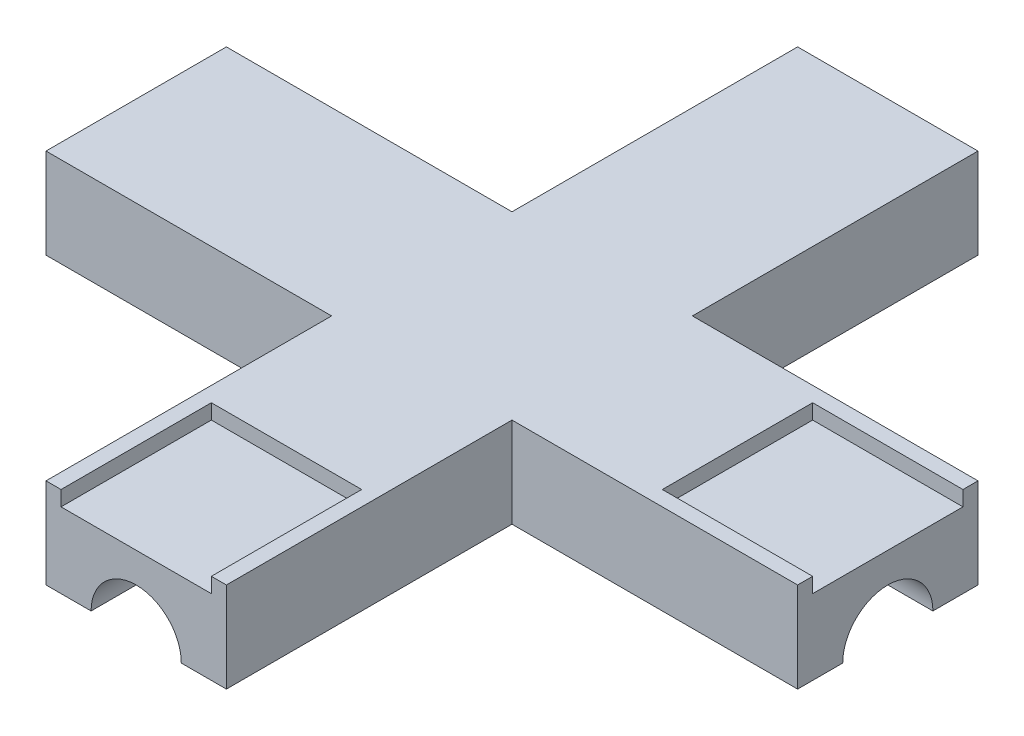
ISO-10303-21;
HEADER;
FILE_DESCRIPTION(('STEP AP214'),'2;1');
FILE_NAME('part.step','',(''),(''),'','','');
FILE_SCHEMA(('AUTOMOTIVE_DESIGN { 1 0 10303 214 1 1 1 1 }'));
ENDSEC;
DATA;
#1=APPLICATION_CONTEXT('core data for automotive mechanical design processes');
#2=APPLICATION_PROTOCOL_DEFINITION('international standard','automotive_design',2000,#1);
#3=PRODUCT_CONTEXT('',#1,'mechanical');
#4=PRODUCT('Part','Part','',(#3));
#5=PRODUCT_RELATED_PRODUCT_CATEGORY('part','',(#4));
#6=PRODUCT_DEFINITION_FORMATION('','',#4);
#7=PRODUCT_DEFINITION_CONTEXT('part definition',#1,'design');
#8=PRODUCT_DEFINITION('design','',#6,#7);
#9=PRODUCT_DEFINITION_SHAPE('','',#8);
#10=(LENGTH_UNIT() NAMED_UNIT(*) SI_UNIT(.MILLI.,.METRE.));
#11=(NAMED_UNIT(*) PLANE_ANGLE_UNIT() SI_UNIT($,.RADIAN.));
#12=(NAMED_UNIT(*) SI_UNIT($,.STERADIAN.) SOLID_ANGLE_UNIT());
#13=UNCERTAINTY_MEASURE_WITH_UNIT(LENGTH_MEASURE(1.E-05),#10,'distance_accuracy_value','');
#14=(GEOMETRIC_REPRESENTATION_CONTEXT(3) GLOBAL_UNCERTAINTY_ASSIGNED_CONTEXT((#13)) GLOBAL_UNIT_ASSIGNED_CONTEXT((#10,
#11,#12)) REPRESENTATION_CONTEXT('',''));
#15=CARTESIAN_POINT('',(0.,0.,0.));
#16=DIRECTION('',(0.,0.,1.));
#17=DIRECTION('',(1.,0.,0.));
#18=AXIS2_PLACEMENT_3D('',#15,#16,#17);
#19=CARTESIAN_POINT('',(-25.001,4.,0.));
#20=DIRECTION('',(1.,0.,0.));
#21=DIRECTION('',(0.,0.,-1.));
#22=AXIS2_PLACEMENT_3D('',#19,#20,#21);
#23=CYLINDRICAL_SURFACE('',#22,3.);
#24=DIRECTION('',(1.,0.,0.));
#25=VECTOR('',#24,1.);
#26=CARTESIAN_POINT('',(-25.001,4.,-3.));
#27=LINE('',#26,#25);
#28=CARTESIAN_POINT('',(-2.99999999999997,4.,-3.));
#29=VERTEX_POINT('',#28);
#30=CARTESIAN_POINT('',(-25.,4.,-3.));
#31=VERTEX_POINT('',#30);
#32=EDGE_CURVE('E403',#29,#31,#27,.F.);
#33=ORIENTED_EDGE('',*,*,#32,.F.);
#34=CARTESIAN_POINT('',(0.,4.,0.));
#35=DIRECTION('',(0.707106781186551,0.,-0.707106781186544));
#36=DIRECTION('',(-0.707106781186544,0.,-0.707106781186551));
#37=AXIS2_PLACEMENT_3D('',#34,#35,#36);
#38=ELLIPSE('',#37,4.24264068711926,3.);
#39=CARTESIAN_POINT('',(0.,7.,0.));
#40=VERTEX_POINT('',#39);
#41=EDGE_CURVE('E315',#40,#29,#38,.F.);
#42=ORIENTED_EDGE('',*,*,#41,.F.);
#43=CARTESIAN_POINT('',(0.,4.,0.));
#44=DIRECTION('',(0.707106781186546,0.,0.707106781186549));
#45=DIRECTION('',(-0.707106781186549,0.,0.707106781186546));
#46=AXIS2_PLACEMENT_3D('',#43,#44,#45);
#47=ELLIPSE('',#46,4.24264068711929,3.);
#48=CARTESIAN_POINT('',(-3.00000000000001,4.,3.));
#49=VERTEX_POINT('',#48);
#50=EDGE_CURVE('E323',#49,#40,#47,.F.);
#51=ORIENTED_EDGE('',*,*,#50,.F.);
#52=DIRECTION('',(1.,0.,0.));
#53=VECTOR('',#52,1.);
#54=CARTESIAN_POINT('',(-25.001,4.,3.));
#55=LINE('',#54,#53);
#56=CARTESIAN_POINT('',(-25.,4.,3.));
#57=VERTEX_POINT('',#56);
#58=EDGE_CURVE('E412',#57,#49,#55,.T.);
#59=ORIENTED_EDGE('',*,*,#58,.F.);
#60=CARTESIAN_POINT('',(-25.,4.,0.));
#61=DIRECTION('',(1.,0.,0.));
#62=DIRECTION('',(0.,0.,-1.));
#63=AXIS2_PLACEMENT_3D('',#60,#61,#62);
#64=CIRCLE('',#63,3.);
#65=EDGE_CURVE('E332',#57,#31,#64,.F.);
#66=ORIENTED_EDGE('',*,*,#65,.T.);
#67=EDGE_LOOP('',(#33,#42,#51,#59,#66));
#68=FACE_BOUND('',#67,.T.);
#69=ADVANCED_FACE('F33',(#68),#23,.F.);
#70=CARTESIAN_POINT('',(-25.,10.,25.));
#71=DIRECTION('',(1.,0.,0.));
#72=DIRECTION('',(0.,0.,-1.));
#73=AXIS2_PLACEMENT_3D('',#70,#71,#72);
#74=PLANE('',#73);
#75=DIRECTION('',(0.,0.,-1.));
#76=VECTOR('',#75,1.);
#77=CARTESIAN_POINT('',(-25.,4.,25.));
#78=LINE('',#77,#76);
#79=CARTESIAN_POINT('',(-25.,4.,6.00000000000001));
#80=VERTEX_POINT('',#79);
#81=EDGE_CURVE('E414',#80,#57,#78,.T.);
#82=ORIENTED_EDGE('',*,*,#81,.F.);
#83=DIRECTION('',(0.,1.,0.));
#84=VECTOR('',#83,1.);
#85=CARTESIAN_POINT('',(-25.,-0.000999999999999265,6.00000000000001));
#86=LINE('',#85,#84);
#87=CARTESIAN_POINT('',(-25.,10.,6.00000000000001));
#88=VERTEX_POINT('',#87);
#89=EDGE_CURVE('E382',#80,#88,#86,.T.);
#90=ORIENTED_EDGE('',*,*,#89,.T.);
#91=DIRECTION('',(0.,0.,1.));
#92=VECTOR('',#91,1.);
#93=CARTESIAN_POINT('',(-25.,10.,25.));
#94=LINE('',#93,#92);
#95=CARTESIAN_POINT('',(-25.,10.,-6.));
#96=VERTEX_POINT('',#95);
#97=EDGE_CURVE('E335',#96,#88,#94,.T.);
#98=ORIENTED_EDGE('',*,*,#97,.F.);
#99=DIRECTION('',(0.,1.,0.));
#100=VECTOR('',#99,1.);
#101=CARTESIAN_POINT('',(-25.,-0.000999999999999265,-6.));
#102=LINE('',#101,#100);
#103=CARTESIAN_POINT('',(-25.,4.,-6.));
#104=VERTEX_POINT('',#103);
#105=EDGE_CURVE('E368',#104,#96,#102,.T.);
#106=ORIENTED_EDGE('',*,*,#105,.F.);
#107=EDGE_CURVE('E56',#31,#104,#78,.T.);
#108=ORIENTED_EDGE('',*,*,#107,.F.);
#109=ORIENTED_EDGE('',*,*,#65,.F.);
#110=EDGE_LOOP('',(#82,#90,#98,#106,#108,#109));
#111=FACE_BOUND('',#110,.T.);
#112=ADVANCED_FACE('F35',(#111),#74,.F.);
#113=CARTESIAN_POINT('',(25.,10.,25.));
#114=DIRECTION('',(0.,0.,-1.));
#115=DIRECTION('',(-1.,0.,0.));
#116=AXIS2_PLACEMENT_3D('',#113,#114,#115);
#117=PLANE('',#116);
#118=DIRECTION('',(-1.,0.,0.));
#119=VECTOR('',#118,1.);
#120=CARTESIAN_POINT('',(25.,4.,25.));
#121=LINE('',#120,#119);
#122=CARTESIAN_POINT('',(6.,4.,25.));
#123=VERTEX_POINT('',#122);
#124=CARTESIAN_POINT('',(2.99999999999991,4.,25.));
#125=VERTEX_POINT('',#124);
#126=EDGE_CURVE('E209',#123,#125,#121,.T.);
#127=ORIENTED_EDGE('',*,*,#126,.F.);
#128=DIRECTION('',(0.,1.,0.));
#129=VECTOR('',#128,1.);
#130=CARTESIAN_POINT('',(6.,-0.000999999999999265,25.));
#131=LINE('',#130,#129);
#132=CARTESIAN_POINT('',(6.,10.,25.));
#133=VERTEX_POINT('',#132);
#134=EDGE_CURVE('E220',#123,#133,#131,.T.);
#135=ORIENTED_EDGE('',*,*,#134,.T.);
#136=DIRECTION('',(1.,0.,0.));
#137=VECTOR('',#136,1.);
#138=CARTESIAN_POINT('',(25.,10.,25.));
#139=LINE('',#138,#137);
#140=CARTESIAN_POINT('',(5.,10.,25.));
#141=VERTEX_POINT('',#140);
#142=EDGE_CURVE('E338',#141,#133,#139,.T.);
#143=ORIENTED_EDGE('',*,*,#142,.F.);
#144=DIRECTION('',(0.,1.,0.));
#145=VECTOR('',#144,1.);
#146=CARTESIAN_POINT('',(5.,9.,25.));
#147=LINE('',#146,#145);
#148=CARTESIAN_POINT('',(5.,9.,25.));
#149=VERTEX_POINT('',#148);
#150=EDGE_CURVE('E273',#149,#141,#147,.T.);
#151=ORIENTED_EDGE('',*,*,#150,.F.);
#152=DIRECTION('',(1.,0.,0.));
#153=VECTOR('',#152,1.);
#154=CARTESIAN_POINT('',(5.,9.,25.));
#155=LINE('',#154,#153);
#156=CARTESIAN_POINT('',(-5.,9.,25.));
#157=VERTEX_POINT('',#156);
#158=EDGE_CURVE('E297',#157,#149,#155,.T.);
#159=ORIENTED_EDGE('',*,*,#158,.F.);
#160=DIRECTION('',(0.,1.,0.));
#161=VECTOR('',#160,1.);
#162=CARTESIAN_POINT('',(-5.,9.,25.));
#163=LINE('',#162,#161);
#164=CARTESIAN_POINT('',(-5.,10.,25.));
#165=VERTEX_POINT('',#164);
#166=EDGE_CURVE('E308',#157,#165,#163,.T.);
#167=ORIENTED_EDGE('',*,*,#166,.T.);
#168=CARTESIAN_POINT('',(-6.00000000000001,10.,25.));
#169=VERTEX_POINT('',#168);
#170=EDGE_CURVE('E339',#169,#165,#139,.T.);
#171=ORIENTED_EDGE('',*,*,#170,.F.);
#172=DIRECTION('',(0.,1.,0.));
#173=VECTOR('',#172,1.);
#174=CARTESIAN_POINT('',(-6.00000000000001,-0.000999999999999265,25.));
#175=LINE('',#174,#173);
#176=CARTESIAN_POINT('',(-6.00000000000001,4.,25.));
#177=VERTEX_POINT('',#176);
#178=EDGE_CURVE('E384',#177,#169,#175,.T.);
#179=ORIENTED_EDGE('',*,*,#178,.F.);
#180=CARTESIAN_POINT('',(-3.00000000000009,4.,25.));
#181=VERTEX_POINT('',#180);
#182=EDGE_CURVE('E228',#181,#177,#121,.T.);
#183=ORIENTED_EDGE('',*,*,#182,.F.);
#184=CARTESIAN_POINT('',(0.,4.,25.));
#185=DIRECTION('',(0.,0.,1.));
#186=DIRECTION('',(1.,0.,0.));
#187=AXIS2_PLACEMENT_3D('',#184,#185,#186);
#188=CIRCLE('',#187,3.);
#189=EDGE_CURVE('E224',#125,#181,#188,.T.);
#190=ORIENTED_EDGE('',*,*,#189,.F.);
#191=EDGE_LOOP('',(#127,#135,#143,#151,#159,#167,#171,#179,#183,#190));
#192=FACE_BOUND('',#191,.T.);
#193=ADVANCED_FACE('F218',(#192),#117,.F.);
#194=CARTESIAN_POINT('',(25.,10.,25.));
#195=DIRECTION('',(-1.,0.,0.));
#196=DIRECTION('',(0.,0.,1.));
#197=AXIS2_PLACEMENT_3D('',#194,#195,#196);
#198=PLANE('',#197);
#199=DIRECTION('',(0.,0.,1.));
#200=VECTOR('',#199,1.);
#201=CARTESIAN_POINT('',(25.,4.,25.));
#202=LINE('',#201,#200);
#203=CARTESIAN_POINT('',(25.,4.,-6.00000000000001));
#204=VERTEX_POINT('',#203);
#205=CARTESIAN_POINT('',(25.,4.,-3.));
#206=VERTEX_POINT('',#205);
#207=EDGE_CURVE('E394',#204,#206,#202,.T.);
#208=ORIENTED_EDGE('',*,*,#207,.F.);
#209=DIRECTION('',(0.,1.,0.));
#210=VECTOR('',#209,1.);
#211=CARTESIAN_POINT('',(25.,-0.000999999999999265,-6.00000000000001));
#212=LINE('',#211,#210);
#213=CARTESIAN_POINT('',(25.,10.,-6.00000000000001));
#214=VERTEX_POINT('',#213);
#215=EDGE_CURVE('E249',#204,#214,#212,.T.);
#216=ORIENTED_EDGE('',*,*,#215,.T.);
#217=DIRECTION('',(0.,0.,-1.));
#218=VECTOR('',#217,1.);
#219=CARTESIAN_POINT('',(25.,10.,25.));
#220=LINE('',#219,#218);
#221=CARTESIAN_POINT('',(25.,10.,-5.));
#222=VERTEX_POINT('',#221);
#223=EDGE_CURVE('E341',#222,#214,#220,.T.);
#224=ORIENTED_EDGE('',*,*,#223,.F.);
#225=DIRECTION('',(0.,1.,0.));
#226=VECTOR('',#225,1.);
#227=CARTESIAN_POINT('',(25.,9.,-5.));
#228=LINE('',#227,#226);
#229=CARTESIAN_POINT('',(25.,9.,-5.));
#230=VERTEX_POINT('',#229);
#231=EDGE_CURVE('E268',#230,#222,#228,.T.);
#232=ORIENTED_EDGE('',*,*,#231,.F.);
#233=DIRECTION('',(0.,0.,-1.));
#234=VECTOR('',#233,1.);
#235=CARTESIAN_POINT('',(25.,9.,-5.));
#236=LINE('',#235,#234);
#237=CARTESIAN_POINT('',(25.,9.,5.));
#238=VERTEX_POINT('',#237);
#239=EDGE_CURVE('E255',#238,#230,#236,.T.);
#240=ORIENTED_EDGE('',*,*,#239,.F.);
#241=DIRECTION('',(0.,1.,0.));
#242=VECTOR('',#241,1.);
#243=CARTESIAN_POINT('',(25.,9.,5.));
#244=LINE('',#243,#242);
#245=CARTESIAN_POINT('',(25.,10.,5.));
#246=VERTEX_POINT('',#245);
#247=EDGE_CURVE('E278',#238,#246,#244,.T.);
#248=ORIENTED_EDGE('',*,*,#247,.T.);
#249=CARTESIAN_POINT('',(25.,10.,6.));
#250=VERTEX_POINT('',#249);
#251=EDGE_CURVE('E342',#250,#246,#220,.T.);
#252=ORIENTED_EDGE('',*,*,#251,.F.);
#253=DIRECTION('',(0.,1.,0.));
#254=VECTOR('',#253,1.);
#255=CARTESIAN_POINT('',(25.,-0.000999999999999265,6.));
#256=LINE('',#255,#254);
#257=CARTESIAN_POINT('',(25.,4.,6.));
#258=VERTEX_POINT('',#257);
#259=EDGE_CURVE('E233',#258,#250,#256,.T.);
#260=ORIENTED_EDGE('',*,*,#259,.F.);
#261=CARTESIAN_POINT('',(25.,4.,3.));
#262=VERTEX_POINT('',#261);
#263=EDGE_CURVE('E226',#262,#258,#202,.T.);
#264=ORIENTED_EDGE('',*,*,#263,.F.);
#265=CARTESIAN_POINT('',(25.,4.,0.));
#266=DIRECTION('',(1.,0.,0.));
#267=DIRECTION('',(0.,0.,-1.));
#268=AXIS2_PLACEMENT_3D('',#265,#266,#267);
#269=CIRCLE('',#268,3.);
#270=EDGE_CURVE('E329',#206,#262,#269,.T.);
#271=ORIENTED_EDGE('',*,*,#270,.F.);
#272=EDGE_LOOP('',(#208,#216,#224,#232,#240,#248,#252,#260,#264,#271));
#273=FACE_BOUND('',#272,.T.);
#274=ADVANCED_FACE('F436',(#273),#198,.F.);
#275=CARTESIAN_POINT('',(25.,10.,-25.));
#276=DIRECTION('',(0.,0.,1.));
#277=DIRECTION('',(1.,0.,0.));
#278=AXIS2_PLACEMENT_3D('',#275,#276,#277);
#279=PLANE('',#278);
#280=DIRECTION('',(1.,0.,0.));
#281=VECTOR('',#280,1.);
#282=CARTESIAN_POINT('',(25.,4.,-25.));
#283=LINE('',#282,#281);
#284=CARTESIAN_POINT('',(-6.,4.,-25.));
#285=VERTEX_POINT('',#284);
#286=CARTESIAN_POINT('',(-2.99999999999974,4.,-25.));
#287=VERTEX_POINT('',#286);
#288=EDGE_CURVE('E360',#285,#287,#283,.T.);
#289=ORIENTED_EDGE('',*,*,#288,.F.);
#290=DIRECTION('',(0.,1.,0.));
#291=VECTOR('',#290,1.);
#292=CARTESIAN_POINT('',(-6.,-0.000999999999999265,-25.));
#293=LINE('',#292,#291);
#294=CARTESIAN_POINT('',(-6.,10.,-25.));
#295=VERTEX_POINT('',#294);
#296=EDGE_CURVE('E245',#285,#295,#293,.T.);
#297=ORIENTED_EDGE('',*,*,#296,.T.);
#298=DIRECTION('',(-1.,0.,0.));
#299=VECTOR('',#298,1.);
#300=CARTESIAN_POINT('',(25.,10.,-25.));
#301=LINE('',#300,#299);
#302=CARTESIAN_POINT('',(6.,10.,-25.));
#303=VERTEX_POINT('',#302);
#304=EDGE_CURVE('E41',#303,#295,#301,.T.);
#305=ORIENTED_EDGE('',*,*,#304,.F.);
#306=DIRECTION('',(0.,1.,0.));
#307=VECTOR('',#306,1.);
#308=CARTESIAN_POINT('',(6.,-0.000999999999999265,-25.));
#309=LINE('',#308,#307);
#310=CARTESIAN_POINT('',(6.,4.,-25.));
#311=VERTEX_POINT('',#310);
#312=EDGE_CURVE('E248',#311,#303,#309,.T.);
#313=ORIENTED_EDGE('',*,*,#312,.F.);
#314=CARTESIAN_POINT('',(3.00000000000026,4.,-25.));
#315=VERTEX_POINT('',#314);
#316=EDGE_CURVE('E48',#315,#311,#283,.T.);
#317=ORIENTED_EDGE('',*,*,#316,.F.);
#318=CARTESIAN_POINT('',(2.61861100413235E-13,4.,-25.));
#319=DIRECTION('',(0.,0.,-1.));
#320=DIRECTION('',(-1.,0.,0.));
#321=AXIS2_PLACEMENT_3D('',#318,#319,#320);
#322=CIRCLE('',#321,3.);
#323=EDGE_CURVE('E318',#287,#315,#322,.T.);
#324=ORIENTED_EDGE('',*,*,#323,.F.);
#325=EDGE_LOOP('',(#289,#297,#305,#313,#317,#324));
#326=FACE_BOUND('',#325,.T.);
#327=ADVANCED_FACE('F357',(#326),#279,.F.);
#328=DIRECTION('',(1.,0.,0.));
#329=VECTOR('',#328,1.);
#330=CARTESIAN_POINT('',(-25.001,4.,-3.));
#331=LINE('',#330,#329);
#332=CARTESIAN_POINT('',(3.00000000000003,4.,-3.));
#333=VERTEX_POINT('',#332);
#334=EDGE_CURVE('E389',#206,#333,#331,.F.);
#335=ORIENTED_EDGE('',*,*,#334,.F.);
#336=ORIENTED_EDGE('',*,*,#270,.T.);
#337=DIRECTION('',(1.,0.,0.));
#338=VECTOR('',#337,1.);
#339=CARTESIAN_POINT('',(-25.001,4.,3.));
#340=LINE('',#339,#338);
#341=CARTESIAN_POINT('',(2.99999999999999,4.,3.));
#342=VERTEX_POINT('',#341);
#343=EDGE_CURVE('E420',#342,#262,#340,.T.);
#344=ORIENTED_EDGE('',*,*,#343,.F.);
#345=CARTESIAN_POINT('',(0.,4.,0.));
#346=DIRECTION('',(-0.707106781186549,0.,0.707106781186546));
#347=DIRECTION('',(0.707106781186546,0.,0.707106781186549));
#348=AXIS2_PLACEMENT_3D('',#345,#346,#347);
#349=ELLIPSE('',#348,4.24264068711928,3.);
#350=EDGE_CURVE('E322',#40,#342,#349,.F.);
#351=ORIENTED_EDGE('',*,*,#350,.F.);
#352=CARTESIAN_POINT('',(0.,4.,0.));
#353=DIRECTION('',(-0.707106781186544,0.,-0.707106781186551));
#354=DIRECTION('',(0.707106781186551,0.,-0.707106781186544));
#355=AXIS2_PLACEMENT_3D('',#352,#353,#354);
#356=ELLIPSE('',#355,4.24264068711931,3.);
#357=EDGE_CURVE('E281',#333,#40,#356,.F.);
#358=ORIENTED_EDGE('',*,*,#357,.F.);
#359=EDGE_LOOP('',(#335,#336,#344,#351,#358));
#360=FACE_BOUND('',#359,.T.);
#361=ADVANCED_FACE('F433',(#360),#23,.F.);
#362=CARTESIAN_POINT('',(-2.61871574857254E-13,4.,25.0010000000003));
#363=DIRECTION('',(0.,0.,-1.));
#364=DIRECTION('',(-1.,0.,0.));
#365=AXIS2_PLACEMENT_3D('',#362,#363,#364);
#366=CYLINDRICAL_SURFACE('',#365,3.);
#367=DIRECTION('',(0.,0.,-1.));
#368=VECTOR('',#367,1.);
#369=CARTESIAN_POINT('',(-3.00000000000026,4.,25.0010000000002));
#370=LINE('',#369,#368);
#371=EDGE_CURVE('E401',#287,#29,#370,.F.);
#372=ORIENTED_EDGE('',*,*,#371,.F.);
#373=ORIENTED_EDGE('',*,*,#323,.T.);
#374=DIRECTION('',(0.,0.,-1.));
#375=VECTOR('',#374,1.);
#376=CARTESIAN_POINT('',(2.99999999999974,4.,25.0010000000003));
#377=LINE('',#376,#375);
#378=EDGE_CURVE('E391',#333,#315,#377,.T.);
#379=ORIENTED_EDGE('',*,*,#378,.F.);
#380=ORIENTED_EDGE('',*,*,#357,.T.);
#381=ORIENTED_EDGE('',*,*,#41,.T.);
#382=EDGE_LOOP('',(#372,#373,#379,#380,#381));
#383=FACE_BOUND('',#382,.T.);
#384=ADVANCED_FACE('F483',(#383),#366,.F.);
#385=CARTESIAN_POINT('',(0.,4.,-25.0010000000001));
#386=DIRECTION('',(0.,0.,1.));
#387=DIRECTION('',(1.,0.,0.));
#388=AXIS2_PLACEMENT_3D('',#385,#386,#387);
#389=CYLINDRICAL_SURFACE('',#388,3.);
#390=DIRECTION('',(0.,0.,1.));
#391=VECTOR('',#390,1.);
#392=CARTESIAN_POINT('',(3.00000000000009,4.,-25.0010000000001));
#393=LINE('',#392,#391);
#394=EDGE_CURVE('E225',#125,#342,#393,.F.);
#395=ORIENTED_EDGE('',*,*,#394,.F.);
#396=ORIENTED_EDGE('',*,*,#189,.T.);
#397=DIRECTION('',(0.,0.,1.));
#398=VECTOR('',#397,1.);
#399=CARTESIAN_POINT('',(-2.99999999999991,4.,-25.0010000000001));
#400=LINE('',#399,#398);
#401=EDGE_CURVE('E410',#49,#181,#400,.T.);
#402=ORIENTED_EDGE('',*,*,#401,.F.);
#403=ORIENTED_EDGE('',*,*,#50,.T.);
#404=ORIENTED_EDGE('',*,*,#350,.T.);
#405=EDGE_LOOP('',(#395,#396,#402,#403,#404));
#406=FACE_BOUND('',#405,.T.);
#407=ADVANCED_FACE('F480',(#406),#389,.F.);
#408=CARTESIAN_POINT('',(25.,-0.000999999999999265,-6.00000000000001));
#409=DIRECTION('',(0.,0.,1.));
#410=DIRECTION('',(1.,0.,0.));
#411=AXIS2_PLACEMENT_3D('',#408,#409,#410);
#412=PLANE('',#411);
#413=DIRECTION('',(1.,0.,0.));
#414=VECTOR('',#413,1.);
#415=CARTESIAN_POINT('',(25.,4.,-6.00000000000001));
#416=LINE('',#415,#414);
#417=CARTESIAN_POINT('',(6.00000000000001,4.,-6.00000000000001));
#418=VERTEX_POINT('',#417);
#419=EDGE_CURVE('E397',#418,#204,#416,.T.);
#420=ORIENTED_EDGE('',*,*,#419,.F.);
#421=DIRECTION('',(0.,1.,0.));
#422=VECTOR('',#421,1.);
#423=CARTESIAN_POINT('',(6.00000000000001,-0.000999999999999265,-6.00000000000001));
#424=LINE('',#423,#422);
#425=CARTESIAN_POINT('',(6.00000000000001,10.,-6.00000000000001));
#426=VERTEX_POINT('',#425);
#427=EDGE_CURVE('E252',#418,#426,#424,.T.);
#428=ORIENTED_EDGE('',*,*,#427,.T.);
#429=DIRECTION('',(1.,0.,0.));
#430=VECTOR('',#429,1.);
#431=CARTESIAN_POINT('',(25.,10.,-6.00000000000001));
#432=LINE('',#431,#430);
#433=EDGE_CURVE('E244',#426,#214,#432,.T.);
#434=ORIENTED_EDGE('',*,*,#433,.T.);
#435=ORIENTED_EDGE('',*,*,#215,.F.);
#436=EDGE_LOOP('',(#420,#428,#434,#435));
#437=FACE_BOUND('',#436,.T.);
#438=ADVANCED_FACE('F482',(#437),#412,.F.);
#439=CARTESIAN_POINT('',(6.,-0.000999999999999265,-25.));
#440=DIRECTION('',(-1.,0.,0.));
#441=DIRECTION('',(0.,0.,1.));
#442=AXIS2_PLACEMENT_3D('',#439,#440,#441);
#443=PLANE('',#442);
#444=DIRECTION('',(0.,0.,1.));
#445=VECTOR('',#444,1.);
#446=CARTESIAN_POINT('',(6.,4.,-25.));
#447=LINE('',#446,#445);
#448=EDGE_CURVE('E399',#311,#418,#447,.T.);
#449=ORIENTED_EDGE('',*,*,#448,.F.);
#450=ORIENTED_EDGE('',*,*,#312,.T.);
#451=DIRECTION('',(0.,0.,1.));
#452=VECTOR('',#451,1.);
#453=CARTESIAN_POINT('',(6.,10.,-25.));
#454=LINE('',#453,#452);
#455=EDGE_CURVE('E241',#303,#426,#454,.T.);
#456=ORIENTED_EDGE('',*,*,#455,.T.);
#457=ORIENTED_EDGE('',*,*,#427,.F.);
#458=EDGE_LOOP('',(#449,#450,#456,#457));
#459=FACE_BOUND('',#458,.T.);
#460=ADVANCED_FACE('F489',(#459),#443,.F.);
#461=CARTESIAN_POINT('',(-6.,-0.000999999999999265,-25.));
#462=DIRECTION('',(1.,0.,0.));
#463=DIRECTION('',(0.,0.,-1.));
#464=AXIS2_PLACEMENT_3D('',#461,#462,#463);
#465=PLANE('',#464);
#466=DIRECTION('',(0.,0.,-1.));
#467=VECTOR('',#466,1.);
#468=CARTESIAN_POINT('',(-6.,4.,-25.));
#469=LINE('',#468,#467);
#470=CARTESIAN_POINT('',(-6.,4.,-6.));
#471=VERTEX_POINT('',#470);
#472=EDGE_CURVE('E406',#471,#285,#469,.T.);
#473=ORIENTED_EDGE('',*,*,#472,.F.);
#474=DIRECTION('',(0.,1.,0.));
#475=VECTOR('',#474,1.);
#476=CARTESIAN_POINT('',(-6.,-0.000999999999999265,-6.));
#477=LINE('',#476,#475);
#478=CARTESIAN_POINT('',(-6.,10.,-6.));
#479=VERTEX_POINT('',#478);
#480=EDGE_CURVE('E363',#471,#479,#477,.T.);
#481=ORIENTED_EDGE('',*,*,#480,.T.);
#482=DIRECTION('',(0.,0.,-1.));
#483=VECTOR('',#482,1.);
#484=CARTESIAN_POINT('',(-6.,10.,-25.));
#485=LINE('',#484,#483);
#486=EDGE_CURVE('E352',#479,#295,#485,.T.);
#487=ORIENTED_EDGE('',*,*,#486,.T.);
#488=ORIENTED_EDGE('',*,*,#296,.F.);
#489=EDGE_LOOP('',(#473,#481,#487,#488));
#490=FACE_BOUND('',#489,.T.);
#491=ADVANCED_FACE('F365',(#490),#465,.F.);
#492=CARTESIAN_POINT('',(-6.,-0.000999999999999265,-6.));
#493=DIRECTION('',(0.,0.,1.));
#494=DIRECTION('',(1.,0.,0.));
#495=AXIS2_PLACEMENT_3D('',#492,#493,#494);
#496=PLANE('',#495);
#497=DIRECTION('',(1.,0.,0.));
#498=VECTOR('',#497,1.);
#499=CARTESIAN_POINT('',(-6.,4.,-6.));
#500=LINE('',#499,#498);
#501=EDGE_CURVE('E408',#104,#471,#500,.T.);
#502=ORIENTED_EDGE('',*,*,#501,.F.);
#503=ORIENTED_EDGE('',*,*,#105,.T.);
#504=DIRECTION('',(1.,0.,0.));
#505=VECTOR('',#504,1.);
#506=CARTESIAN_POINT('',(-6.,10.,-6.));
#507=LINE('',#506,#505);
#508=EDGE_CURVE('E369',#96,#479,#507,.T.);
#509=ORIENTED_EDGE('',*,*,#508,.T.);
#510=ORIENTED_EDGE('',*,*,#480,.F.);
#511=EDGE_LOOP('',(#502,#503,#509,#510));
#512=FACE_BOUND('',#511,.T.);
#513=ADVANCED_FACE('F560',(#512),#496,.F.);
#514=CARTESIAN_POINT('',(-6.00000000000001,-0.000999999999999265,6.));
#515=DIRECTION('',(0.,0.,-1.));
#516=DIRECTION('',(-1.,0.,0.));
#517=AXIS2_PLACEMENT_3D('',#514,#515,#516);
#518=PLANE('',#517);
#519=DIRECTION('',(-1.,0.,0.));
#520=VECTOR('',#519,1.);
#521=CARTESIAN_POINT('',(-6.00000000000001,4.,6.));
#522=LINE('',#521,#520);
#523=CARTESIAN_POINT('',(-6.00000000000001,4.,6.));
#524=VERTEX_POINT('',#523);
#525=EDGE_CURVE('E416',#524,#80,#522,.T.);
#526=ORIENTED_EDGE('',*,*,#525,.F.);
#527=DIRECTION('',(0.,1.,0.));
#528=VECTOR('',#527,1.);
#529=CARTESIAN_POINT('',(-6.00000000000001,-0.000999999999999265,6.));
#530=LINE('',#529,#528);
#531=CARTESIAN_POINT('',(-6.00000000000001,10.,6.));
#532=VERTEX_POINT('',#531);
#533=EDGE_CURVE('E372',#524,#532,#530,.T.);
#534=ORIENTED_EDGE('',*,*,#533,.T.);
#535=DIRECTION('',(-1.,0.,0.));
#536=VECTOR('',#535,1.);
#537=CARTESIAN_POINT('',(-6.00000000000001,10.,6.));
#538=LINE('',#537,#536);
#539=EDGE_CURVE('E236',#532,#88,#538,.T.);
#540=ORIENTED_EDGE('',*,*,#539,.T.);
#541=ORIENTED_EDGE('',*,*,#89,.F.);
#542=EDGE_LOOP('',(#526,#534,#540,#541));
#543=FACE_BOUND('',#542,.T.);
#544=ADVANCED_FACE('F468',(#543),#518,.F.);
#545=CARTESIAN_POINT('',(-6.00000000000001,-0.000999999999999265,6.));
#546=DIRECTION('',(1.,0.,0.));
#547=DIRECTION('',(0.,0.,-1.));
#548=AXIS2_PLACEMENT_3D('',#545,#546,#547);
#549=PLANE('',#548);
#550=DIRECTION('',(0.,0.,-1.));
#551=VECTOR('',#550,1.);
#552=CARTESIAN_POINT('',(-6.00000000000001,4.,6.));
#553=LINE('',#552,#551);
#554=EDGE_CURVE('E418',#177,#524,#553,.T.);
#555=ORIENTED_EDGE('',*,*,#554,.F.);
#556=ORIENTED_EDGE('',*,*,#178,.T.);
#557=DIRECTION('',(0.,0.,-1.));
#558=VECTOR('',#557,1.);
#559=CARTESIAN_POINT('',(-6.00000000000001,10.,6.));
#560=LINE('',#559,#558);
#561=EDGE_CURVE('E379',#169,#532,#560,.T.);
#562=ORIENTED_EDGE('',*,*,#561,.T.);
#563=ORIENTED_EDGE('',*,*,#533,.F.);
#564=EDGE_LOOP('',(#555,#556,#562,#563));
#565=FACE_BOUND('',#564,.T.);
#566=ADVANCED_FACE('F461',(#565),#549,.F.);
#567=CARTESIAN_POINT('',(25.,-0.000999999999999265,6.));
#568=DIRECTION('',(0.,0.,-1.));
#569=DIRECTION('',(-1.,0.,0.));
#570=AXIS2_PLACEMENT_3D('',#567,#568,#569);
#571=PLANE('',#570);
#572=DIRECTION('',(-1.,0.,0.));
#573=VECTOR('',#572,1.);
#574=CARTESIAN_POINT('',(25.,4.,6.));
#575=LINE('',#574,#573);
#576=CARTESIAN_POINT('',(6.,4.,6.));
#577=VERTEX_POINT('',#576);
#578=EDGE_CURVE('E212',#258,#577,#575,.T.);
#579=ORIENTED_EDGE('',*,*,#578,.F.);
#580=ORIENTED_EDGE('',*,*,#259,.T.);
#581=DIRECTION('',(-1.,0.,0.));
#582=VECTOR('',#581,1.);
#583=CARTESIAN_POINT('',(25.,10.,6.));
#584=LINE('',#583,#582);
#585=CARTESIAN_POINT('',(6.,10.,6.));
#586=VERTEX_POINT('',#585);
#587=EDGE_CURVE('E387',#250,#586,#584,.T.);
#588=ORIENTED_EDGE('',*,*,#587,.T.);
#589=DIRECTION('',(0.,1.,0.));
#590=VECTOR('',#589,1.);
#591=CARTESIAN_POINT('',(6.,-0.000999999999999265,6.));
#592=LINE('',#591,#590);
#593=EDGE_CURVE('E234',#577,#586,#592,.T.);
#594=ORIENTED_EDGE('',*,*,#593,.F.);
#595=EDGE_LOOP('',(#579,#580,#588,#594));
#596=FACE_BOUND('',#595,.T.);
#597=ADVANCED_FACE('F439',(#596),#571,.F.);
#598=CARTESIAN_POINT('',(6.,-0.000999999999999265,6.));
#599=DIRECTION('',(-1.,0.,0.));
#600=DIRECTION('',(0.,0.,1.));
#601=AXIS2_PLACEMENT_3D('',#598,#599,#600);
#602=PLANE('',#601);
#603=DIRECTION('',(0.,0.,1.));
#604=VECTOR('',#603,1.);
#605=CARTESIAN_POINT('',(6.,4.,6.));
#606=LINE('',#605,#604);
#607=EDGE_CURVE('E11',#577,#123,#606,.T.);
#608=ORIENTED_EDGE('',*,*,#607,.F.);
#609=ORIENTED_EDGE('',*,*,#593,.T.);
#610=DIRECTION('',(0.,0.,1.));
#611=VECTOR('',#610,1.);
#612=CARTESIAN_POINT('',(6.,10.,6.));
#613=LINE('',#612,#611);
#614=EDGE_CURVE('E231',#586,#133,#613,.T.);
#615=ORIENTED_EDGE('',*,*,#614,.T.);
#616=ORIENTED_EDGE('',*,*,#134,.F.);
#617=EDGE_LOOP('',(#608,#609,#615,#616));
#618=FACE_BOUND('',#617,.T.);
#619=ADVANCED_FACE('F229',(#618),#602,.F.);
#620=CARTESIAN_POINT('',(0.,10.,0.));
#621=DIRECTION('',(0.,1.,0.));
#622=DIRECTION('',(0.,0.,1.));
#623=AXIS2_PLACEMENT_3D('',#620,#621,#622);
#624=PLANE('',#623);
#625=ORIENTED_EDGE('',*,*,#587,.F.);
#626=ORIENTED_EDGE('',*,*,#251,.T.);
#627=DIRECTION('',(1.,0.,0.));
#628=VECTOR('',#627,1.);
#629=CARTESIAN_POINT('',(25.,10.,5.));
#630=LINE('',#629,#628);
#631=CARTESIAN_POINT('',(15.,10.,5.));
#632=VERTEX_POINT('',#631);
#633=EDGE_CURVE('E259',#632,#246,#630,.T.);
#634=ORIENTED_EDGE('',*,*,#633,.F.);
#635=DIRECTION('',(0.,0.,1.));
#636=VECTOR('',#635,1.);
#637=CARTESIAN_POINT('',(15.,10.,-5.));
#638=LINE('',#637,#636);
#639=CARTESIAN_POINT('',(15.,10.,-5.));
#640=VERTEX_POINT('',#639);
#641=EDGE_CURVE('E272',#640,#632,#638,.T.);
#642=ORIENTED_EDGE('',*,*,#641,.F.);
#643=DIRECTION('',(-1.,0.,0.));
#644=VECTOR('',#643,1.);
#645=CARTESIAN_POINT('',(25.,10.,-5.));
#646=LINE('',#645,#644);
#647=EDGE_CURVE('E269',#222,#640,#646,.T.);
#648=ORIENTED_EDGE('',*,*,#647,.F.);
#649=ORIENTED_EDGE('',*,*,#223,.T.);
#650=ORIENTED_EDGE('',*,*,#433,.F.);
#651=ORIENTED_EDGE('',*,*,#455,.F.);
#652=ORIENTED_EDGE('',*,*,#304,.T.);
#653=ORIENTED_EDGE('',*,*,#486,.F.);
#654=ORIENTED_EDGE('',*,*,#508,.F.);
#655=ORIENTED_EDGE('',*,*,#97,.T.);
#656=ORIENTED_EDGE('',*,*,#539,.F.);
#657=ORIENTED_EDGE('',*,*,#561,.F.);
#658=ORIENTED_EDGE('',*,*,#170,.T.);
#659=DIRECTION('',(0.,0.,1.));
#660=VECTOR('',#659,1.);
#661=CARTESIAN_POINT('',(-5.,10.,25.));
#662=LINE('',#661,#660);
#663=CARTESIAN_POINT('',(-5.,10.,15.));
#664=VERTEX_POINT('',#663);
#665=EDGE_CURVE('E291',#664,#165,#662,.T.);
#666=ORIENTED_EDGE('',*,*,#665,.F.);
#667=DIRECTION('',(-1.,0.,0.));
#668=VECTOR('',#667,1.);
#669=CARTESIAN_POINT('',(5.,10.,15.));
#670=LINE('',#669,#668);
#671=CARTESIAN_POINT('',(5.,10.,15.));
#672=VERTEX_POINT('',#671);
#673=EDGE_CURVE('E302',#672,#664,#670,.T.);
#674=ORIENTED_EDGE('',*,*,#673,.F.);
#675=DIRECTION('',(0.,0.,-1.));
#676=VECTOR('',#675,1.);
#677=CARTESIAN_POINT('',(5.,10.,25.));
#678=LINE('',#677,#676);
#679=EDGE_CURVE('E251',#141,#672,#678,.T.);
#680=ORIENTED_EDGE('',*,*,#679,.F.);
#681=ORIENTED_EDGE('',*,*,#142,.T.);
#682=ORIENTED_EDGE('',*,*,#614,.F.);
#683=EDGE_LOOP('',(#625,#626,#634,#642,#648,#649,#650,#651,#652,#653,#654,#655,#656,#657,#658,
#666,#674,#680,#681,#682));
#684=FACE_BOUND('',#683,.T.);
#685=ADVANCED_FACE('F349',(#684),#624,.T.);
#686=CARTESIAN_POINT('',(5.,9.,25.));
#687=DIRECTION('',(1.,0.,0.));
#688=DIRECTION('',(0.,0.,-1.));
#689=AXIS2_PLACEMENT_3D('',#686,#687,#688);
#690=PLANE('',#689);
#691=ORIENTED_EDGE('',*,*,#679,.T.);
#692=DIRECTION('',(0.,1.,0.));
#693=VECTOR('',#692,1.);
#694=CARTESIAN_POINT('',(5.,9.,15.));
#695=LINE('',#694,#693);
#696=CARTESIAN_POINT('',(5.,9.,15.));
#697=VERTEX_POINT('',#696);
#698=EDGE_CURVE('E300',#697,#672,#695,.T.);
#699=ORIENTED_EDGE('',*,*,#698,.F.);
#700=DIRECTION('',(0.,0.,-1.));
#701=VECTOR('',#700,1.);
#702=CARTESIAN_POINT('',(5.,9.,25.));
#703=LINE('',#702,#701);
#704=EDGE_CURVE('E287',#149,#697,#703,.T.);
#705=ORIENTED_EDGE('',*,*,#704,.F.);
#706=ORIENTED_EDGE('',*,*,#150,.T.);
#707=EDGE_LOOP('',(#691,#699,#705,#706));
#708=FACE_BOUND('',#707,.T.);
#709=ADVANCED_FACE('F446',(#708),#690,.F.);
#710=CARTESIAN_POINT('',(-5.,9.,25.));
#711=DIRECTION('',(-1.,0.,0.));
#712=DIRECTION('',(0.,0.,1.));
#713=AXIS2_PLACEMENT_3D('',#710,#711,#712);
#714=PLANE('',#713);
#715=ORIENTED_EDGE('',*,*,#665,.T.);
#716=ORIENTED_EDGE('',*,*,#166,.F.);
#717=DIRECTION('',(0.,0.,1.));
#718=VECTOR('',#717,1.);
#719=CARTESIAN_POINT('',(-5.,9.,25.));
#720=LINE('',#719,#718);
#721=CARTESIAN_POINT('',(-5.,9.,15.));
#722=VERTEX_POINT('',#721);
#723=EDGE_CURVE('E294',#722,#157,#720,.T.);
#724=ORIENTED_EDGE('',*,*,#723,.F.);
#725=DIRECTION('',(0.,1.,0.));
#726=VECTOR('',#725,1.);
#727=CARTESIAN_POINT('',(-5.,9.,15.));
#728=LINE('',#727,#726);
#729=EDGE_CURVE('E311',#722,#664,#728,.T.);
#730=ORIENTED_EDGE('',*,*,#729,.T.);
#731=EDGE_LOOP('',(#715,#716,#724,#730));
#732=FACE_BOUND('',#731,.T.);
#733=ADVANCED_FACE('F452',(#732),#714,.F.);
#734=CARTESIAN_POINT('',(5.,9.,15.));
#735=DIRECTION('',(0.,0.,-1.));
#736=DIRECTION('',(-1.,0.,0.));
#737=AXIS2_PLACEMENT_3D('',#734,#735,#736);
#738=PLANE('',#737);
#739=ORIENTED_EDGE('',*,*,#673,.T.);
#740=ORIENTED_EDGE('',*,*,#729,.F.);
#741=DIRECTION('',(-1.,0.,0.));
#742=VECTOR('',#741,1.);
#743=CARTESIAN_POINT('',(5.,9.,15.));
#744=LINE('',#743,#742);
#745=EDGE_CURVE('E290',#697,#722,#744,.T.);
#746=ORIENTED_EDGE('',*,*,#745,.F.);
#747=ORIENTED_EDGE('',*,*,#698,.T.);
#748=EDGE_LOOP('',(#739,#740,#746,#747));
#749=FACE_BOUND('',#748,.T.);
#750=ADVANCED_FACE('F657',(#749),#738,.F.);
#751=CARTESIAN_POINT('',(0.,9.,0.));
#752=DIRECTION('',(0.,1.,0.));
#753=DIRECTION('',(0.,0.,1.));
#754=AXIS2_PLACEMENT_3D('',#751,#752,#753);
#755=PLANE('',#754);
#756=ORIENTED_EDGE('',*,*,#704,.T.);
#757=ORIENTED_EDGE('',*,*,#745,.T.);
#758=ORIENTED_EDGE('',*,*,#723,.T.);
#759=ORIENTED_EDGE('',*,*,#158,.T.);
#760=EDGE_LOOP('',(#756,#757,#758,#759));
#761=FACE_BOUND('',#760,.T.);
#762=ADVANCED_FACE('F449',(#761),#755,.T.);
#763=CARTESIAN_POINT('',(25.,9.,5.));
#764=DIRECTION('',(0.,0.,1.));
#765=DIRECTION('',(1.,0.,0.));
#766=AXIS2_PLACEMENT_3D('',#763,#764,#765);
#767=PLANE('',#766);
#768=ORIENTED_EDGE('',*,*,#633,.T.);
#769=ORIENTED_EDGE('',*,*,#247,.F.);
#770=DIRECTION('',(1.,0.,0.));
#771=VECTOR('',#770,1.);
#772=CARTESIAN_POINT('',(25.,9.,5.));
#773=LINE('',#772,#771);
#774=CARTESIAN_POINT('',(15.,9.,5.));
#775=VERTEX_POINT('',#774);
#776=EDGE_CURVE('E265',#775,#238,#773,.T.);
#777=ORIENTED_EDGE('',*,*,#776,.F.);
#778=DIRECTION('',(0.,1.,0.));
#779=VECTOR('',#778,1.);
#780=CARTESIAN_POINT('',(15.,9.,5.));
#781=LINE('',#780,#779);
#782=EDGE_CURVE('E282',#775,#632,#781,.T.);
#783=ORIENTED_EDGE('',*,*,#782,.T.);
#784=EDGE_LOOP('',(#768,#769,#777,#783));
#785=FACE_BOUND('',#784,.T.);
#786=ADVANCED_FACE('F644',(#785),#767,.F.);
#787=CARTESIAN_POINT('',(15.,9.,-5.));
#788=DIRECTION('',(-1.,0.,0.));
#789=DIRECTION('',(0.,0.,1.));
#790=AXIS2_PLACEMENT_3D('',#787,#788,#789);
#791=PLANE('',#790);
#792=ORIENTED_EDGE('',*,*,#641,.T.);
#793=ORIENTED_EDGE('',*,*,#782,.F.);
#794=DIRECTION('',(0.,0.,1.));
#795=VECTOR('',#794,1.);
#796=CARTESIAN_POINT('',(15.,9.,-5.));
#797=LINE('',#796,#795);
#798=CARTESIAN_POINT('',(15.,9.,-5.));
#799=VERTEX_POINT('',#798);
#800=EDGE_CURVE('E262',#799,#775,#797,.T.);
#801=ORIENTED_EDGE('',*,*,#800,.F.);
#802=DIRECTION('',(0.,1.,0.));
#803=VECTOR('',#802,1.);
#804=CARTESIAN_POINT('',(15.,9.,-5.));
#805=LINE('',#804,#803);
#806=EDGE_CURVE('E284',#799,#640,#805,.T.);
#807=ORIENTED_EDGE('',*,*,#806,.T.);
#808=EDGE_LOOP('',(#792,#793,#801,#807));
#809=FACE_BOUND('',#808,.T.);
#810=ADVANCED_FACE('F647',(#809),#791,.F.);
#811=CARTESIAN_POINT('',(25.,9.,-5.));
#812=DIRECTION('',(0.,0.,-1.));
#813=DIRECTION('',(-1.,0.,0.));
#814=AXIS2_PLACEMENT_3D('',#811,#812,#813);
#815=PLANE('',#814);
#816=ORIENTED_EDGE('',*,*,#647,.T.);
#817=ORIENTED_EDGE('',*,*,#806,.F.);
#818=DIRECTION('',(-1.,0.,0.));
#819=VECTOR('',#818,1.);
#820=CARTESIAN_POINT('',(25.,9.,-5.));
#821=LINE('',#820,#819);
#822=EDGE_CURVE('E258',#230,#799,#821,.T.);
#823=ORIENTED_EDGE('',*,*,#822,.F.);
#824=ORIENTED_EDGE('',*,*,#231,.T.);
#825=EDGE_LOOP('',(#816,#817,#823,#824));
#826=FACE_BOUND('',#825,.T.);
#827=ADVANCED_FACE('F642',(#826),#815,.F.);
#828=CARTESIAN_POINT('',(0.,9.,0.));
#829=DIRECTION('',(0.,-1.,0.));
#830=DIRECTION('',(0.,0.,-1.));
#831=AXIS2_PLACEMENT_3D('',#828,#829,#830);
#832=PLANE('',#831);
#833=ORIENTED_EDGE('',*,*,#239,.T.);
#834=ORIENTED_EDGE('',*,*,#822,.T.);
#835=ORIENTED_EDGE('',*,*,#800,.T.);
#836=ORIENTED_EDGE('',*,*,#776,.T.);
#837=EDGE_LOOP('',(#833,#834,#835,#836));
#838=FACE_BOUND('',#837,.T.);
#839=ADVANCED_FACE('F612',(#838),#832,.F.);
#840=CARTESIAN_POINT('',(0.,4.,0.));
#841=DIRECTION('',(0.,-1.,0.));
#842=DIRECTION('',(0.,0.,-1.));
#843=AXIS2_PLACEMENT_3D('',#840,#841,#842);
#844=PLANE('',#843);
#845=ORIENTED_EDGE('',*,*,#343,.T.);
#846=ORIENTED_EDGE('',*,*,#263,.T.);
#847=ORIENTED_EDGE('',*,*,#578,.T.);
#848=ORIENTED_EDGE('',*,*,#607,.T.);
#849=ORIENTED_EDGE('',*,*,#126,.T.);
#850=ORIENTED_EDGE('',*,*,#394,.T.);
#851=EDGE_LOOP('',(#845,#846,#847,#848,#849,#850));
#852=FACE_BOUND('',#851,.T.);
#853=ADVANCED_FACE('F208',(#852),#844,.T.);
#854=ORIENTED_EDGE('',*,*,#401,.T.);
#855=ORIENTED_EDGE('',*,*,#182,.T.);
#856=ORIENTED_EDGE('',*,*,#554,.T.);
#857=ORIENTED_EDGE('',*,*,#525,.T.);
#858=ORIENTED_EDGE('',*,*,#81,.T.);
#859=ORIENTED_EDGE('',*,*,#58,.T.);
#860=EDGE_LOOP('',(#854,#855,#856,#857,#858,#859));
#861=FACE_BOUND('',#860,.T.);
#862=ADVANCED_FACE('F464',(#861),#844,.T.);
#863=ORIENTED_EDGE('',*,*,#371,.T.);
#864=ORIENTED_EDGE('',*,*,#32,.T.);
#865=ORIENTED_EDGE('',*,*,#107,.T.);
#866=ORIENTED_EDGE('',*,*,#501,.T.);
#867=ORIENTED_EDGE('',*,*,#472,.T.);
#868=ORIENTED_EDGE('',*,*,#288,.T.);
#869=EDGE_LOOP('',(#863,#864,#865,#866,#867,#868));
#870=FACE_BOUND('',#869,.T.);
#871=ADVANCED_FACE('F623',(#870),#844,.T.);
#872=ORIENTED_EDGE('',*,*,#334,.T.);
#873=ORIENTED_EDGE('',*,*,#378,.T.);
#874=ORIENTED_EDGE('',*,*,#316,.T.);
#875=ORIENTED_EDGE('',*,*,#448,.T.);
#876=ORIENTED_EDGE('',*,*,#419,.T.);
#877=ORIENTED_EDGE('',*,*,#207,.T.);
#878=EDGE_LOOP('',(#872,#873,#874,#875,#876,#877));
#879=FACE_BOUND('',#878,.T.);
#880=ADVANCED_FACE('F426',(#879),#844,.T.);
#881=CLOSED_SHELL('',(#69,#112,#193,#274,#327,#361,#384,#407,#438,#460,#491,#513,#544,#566,#597,
#619,#685,#709,#733,#750,#762,#786,#810,#827,#839,#853,#862,#871,#880));
#882=MANIFOLD_SOLID_BREP('B2',#881);
#883=ADVANCED_BREP_SHAPE_REPRESENTATION('',(#18,#882),#14);
#884=SHAPE_DEFINITION_REPRESENTATION(#9,#883);
ENDSEC;
END-ISO-10303-21;
